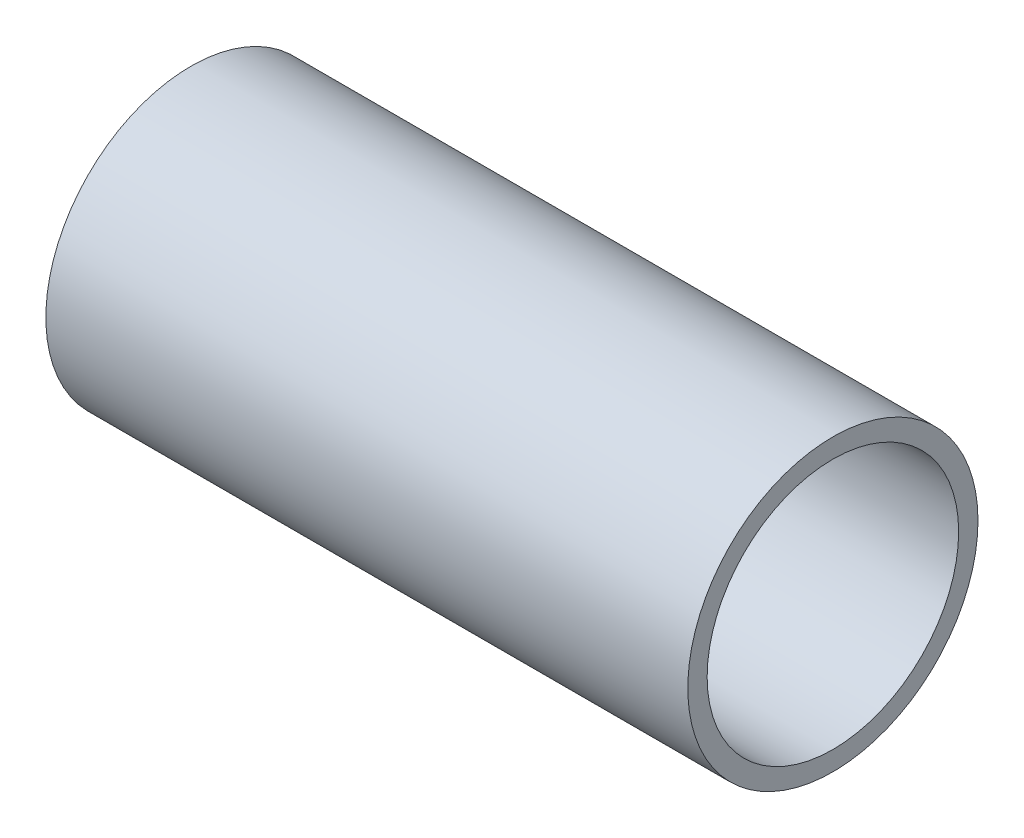
ISO-10303-21;
HEADER;
FILE_DESCRIPTION(('STEP AP214'),'2;1');
FILE_NAME('part.step','',(''),(''),'','','');
FILE_SCHEMA(('AUTOMOTIVE_DESIGN { 1 0 10303 214 1 1 1 1 }'));
ENDSEC;
DATA;
#1=APPLICATION_CONTEXT('core data for automotive mechanical design processes');
#2=APPLICATION_PROTOCOL_DEFINITION('international standard','automotive_design',2000,#1);
#3=PRODUCT_CONTEXT('',#1,'mechanical');
#4=PRODUCT('Part','Part','',(#3));
#5=PRODUCT_RELATED_PRODUCT_CATEGORY('part','',(#4));
#6=PRODUCT_DEFINITION_FORMATION('','',#4);
#7=PRODUCT_DEFINITION_CONTEXT('part definition',#1,'design');
#8=PRODUCT_DEFINITION('design','',#6,#7);
#9=PRODUCT_DEFINITION_SHAPE('','',#8);
#10=(LENGTH_UNIT() NAMED_UNIT(*) SI_UNIT(.MILLI.,.METRE.));
#11=(NAMED_UNIT(*) PLANE_ANGLE_UNIT() SI_UNIT($,.RADIAN.));
#12=(NAMED_UNIT(*) SI_UNIT($,.STERADIAN.) SOLID_ANGLE_UNIT());
#13=UNCERTAINTY_MEASURE_WITH_UNIT(LENGTH_MEASURE(1.E-05),#10,'distance_accuracy_value','');
#14=(GEOMETRIC_REPRESENTATION_CONTEXT(3) GLOBAL_UNCERTAINTY_ASSIGNED_CONTEXT((#13)) GLOBAL_UNIT_ASSIGNED_CONTEXT((#10,
#11,#12)) REPRESENTATION_CONTEXT('',''));
#15=CARTESIAN_POINT('',(0.,0.,0.));
#16=DIRECTION('',(0.,0.,1.));
#17=DIRECTION('',(1.,0.,0.));
#18=AXIS2_PLACEMENT_3D('',#15,#16,#17);
#19=CARTESIAN_POINT('',(36.5,0.,0.));
#20=DIRECTION('',(1.,0.,0.));
#21=DIRECTION('',(0.,0.,-1.));
#22=AXIS2_PLACEMENT_3D('',#19,#20,#21);
#23=PLANE('',#22);
#24=CARTESIAN_POINT('',(36.5,0.,0.));
#25=DIRECTION('',(1.,0.,0.));
#26=DIRECTION('',(0.,0.,-1.));
#27=AXIS2_PLACEMENT_3D('',#24,#25,#26);
#28=CIRCLE('',#27,16.5);
#29=CARTESIAN_POINT('',(36.5,0.,-16.5));
#30=VERTEX_POINT('',#29);
#31=EDGE_CURVE('E10',#30,#30,#28,.T.);
#32=ORIENTED_EDGE('',*,*,#31,.T.);
#33=EDGE_LOOP('',(#32));
#34=FACE_BOUND('',#33,.T.);
#35=CARTESIAN_POINT('',(36.5,0.,0.));
#36=DIRECTION('',(1.,0.,0.));
#37=DIRECTION('',(0.,0.,-1.));
#38=AXIS2_PLACEMENT_3D('',#35,#36,#37);
#39=CIRCLE('',#38,14.3);
#40=CARTESIAN_POINT('',(36.5,0.,-14.3));
#41=VERTEX_POINT('',#40);
#42=EDGE_CURVE('E50',#41,#41,#39,.T.);
#43=ORIENTED_EDGE('',*,*,#42,.F.);
#44=EDGE_LOOP('',(#43));
#45=FACE_BOUND('',#44,.T.);
#46=ADVANCED_FACE('F37',(#34,#45),#23,.T.);
#47=CARTESIAN_POINT('',(-36.5,0.,0.));
#48=DIRECTION('',(1.,0.,0.));
#49=DIRECTION('',(0.,0.,-1.));
#50=AXIS2_PLACEMENT_3D('',#47,#48,#49);
#51=PLANE('',#50);
#52=CARTESIAN_POINT('',(-36.5,0.,0.));
#53=DIRECTION('',(1.,0.,0.));
#54=DIRECTION('',(0.,0.,-1.));
#55=AXIS2_PLACEMENT_3D('',#52,#53,#54);
#56=CIRCLE('',#55,16.5);
#57=CARTESIAN_POINT('',(-36.5,0.,-16.5));
#58=VERTEX_POINT('',#57);
#59=EDGE_CURVE('E41',#58,#58,#56,.T.);
#60=ORIENTED_EDGE('',*,*,#59,.F.);
#61=EDGE_LOOP('',(#60));
#62=FACE_BOUND('',#61,.T.);
#63=CARTESIAN_POINT('',(-36.5,0.,0.));
#64=DIRECTION('',(1.,0.,0.));
#65=DIRECTION('',(0.,0.,-1.));
#66=AXIS2_PLACEMENT_3D('',#63,#64,#65);
#67=CIRCLE('',#66,14.3);
#68=CARTESIAN_POINT('',(-36.5,0.,-14.3));
#69=VERTEX_POINT('',#68);
#70=EDGE_CURVE('E52',#69,#69,#67,.T.);
#71=ORIENTED_EDGE('',*,*,#70,.T.);
#72=EDGE_LOOP('',(#71));
#73=FACE_BOUND('',#72,.T.);
#74=ADVANCED_FACE('F64',(#62,#73),#51,.F.);
#75=CARTESIAN_POINT('',(36.5,0.,0.));
#76=DIRECTION('',(-1.,0.,0.));
#77=DIRECTION('',(0.,0.,1.));
#78=AXIS2_PLACEMENT_3D('',#75,#76,#77);
#79=CYLINDRICAL_SURFACE('',#78,16.5);
#80=ORIENTED_EDGE('',*,*,#31,.F.);
#81=EDGE_LOOP('',(#80));
#82=FACE_BOUND('',#81,.T.);
#83=ORIENTED_EDGE('',*,*,#59,.T.);
#84=EDGE_LOOP('',(#83));
#85=FACE_BOUND('',#84,.T.);
#86=ADVANCED_FACE('F39',(#82,#85),#79,.T.);
#87=CARTESIAN_POINT('',(36.5,0.,0.));
#88=DIRECTION('',(-1.,0.,0.));
#89=DIRECTION('',(0.,0.,1.));
#90=AXIS2_PLACEMENT_3D('',#87,#88,#89);
#91=CYLINDRICAL_SURFACE('',#90,14.3);
#92=ORIENTED_EDGE('',*,*,#42,.T.);
#93=EDGE_LOOP('',(#92));
#94=FACE_BOUND('',#93,.T.);
#95=ORIENTED_EDGE('',*,*,#70,.F.);
#96=EDGE_LOOP('',(#95));
#97=FACE_BOUND('',#96,.T.);
#98=ADVANCED_FACE('F60',(#94,#97),#91,.F.);
#99=CLOSED_SHELL('',(#46,#74,#86,#98));
#100=MANIFOLD_SOLID_BREP('B2',#99);
#101=ADVANCED_BREP_SHAPE_REPRESENTATION('',(#18,#100),#14);
#102=SHAPE_DEFINITION_REPRESENTATION(#9,#101);
ENDSEC;
END-ISO-10303-21;
